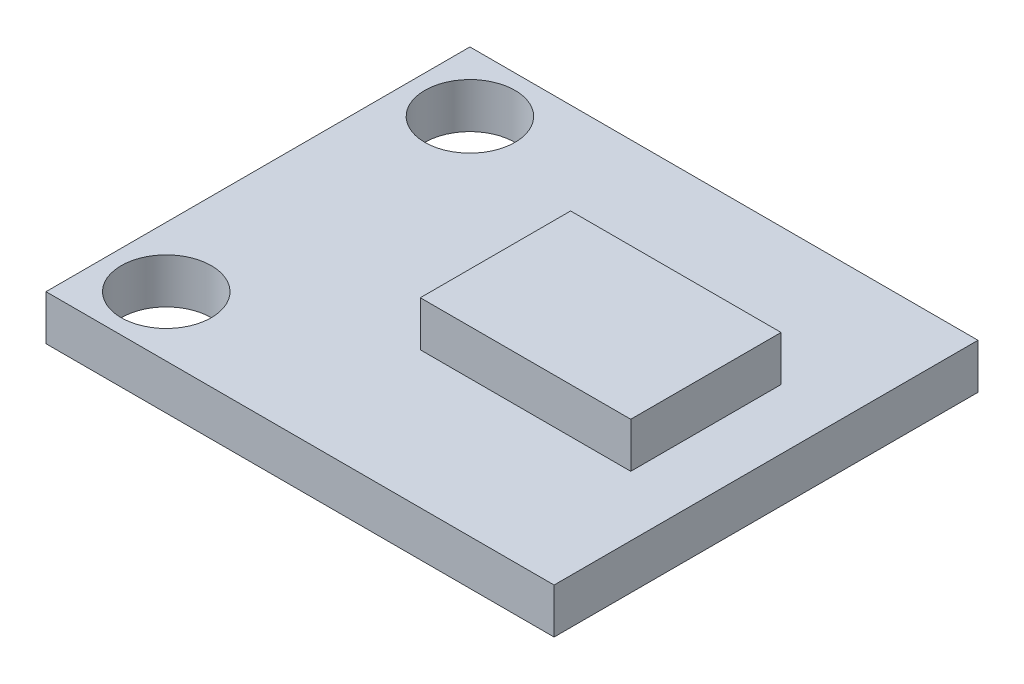
ISO-10303-21;
HEADER;
FILE_DESCRIPTION(('STEP AP214'),'2;1');
FILE_NAME('part.step','',(''),(''),'','','');
FILE_SCHEMA(('AUTOMOTIVE_DESIGN { 1 0 10303 214 1 1 1 1 }'));
ENDSEC;
DATA;
#1=APPLICATION_CONTEXT('core data for automotive mechanical design processes');
#2=APPLICATION_PROTOCOL_DEFINITION('international standard','automotive_design',2000,#1);
#3=PRODUCT_CONTEXT('',#1,'mechanical');
#4=PRODUCT('Part','Part','',(#3));
#5=PRODUCT_RELATED_PRODUCT_CATEGORY('part','',(#4));
#6=PRODUCT_DEFINITION_FORMATION('','',#4);
#7=PRODUCT_DEFINITION_CONTEXT('part definition',#1,'design');
#8=PRODUCT_DEFINITION('design','',#6,#7);
#9=PRODUCT_DEFINITION_SHAPE('','',#8);
#10=(LENGTH_UNIT() NAMED_UNIT(*) SI_UNIT(.MILLI.,.METRE.));
#11=(NAMED_UNIT(*) PLANE_ANGLE_UNIT() SI_UNIT($,.RADIAN.));
#12=(NAMED_UNIT(*) SI_UNIT($,.STERADIAN.) SOLID_ANGLE_UNIT());
#13=UNCERTAINTY_MEASURE_WITH_UNIT(LENGTH_MEASURE(1.E-05),#10,'distance_accuracy_value','');
#14=(GEOMETRIC_REPRESENTATION_CONTEXT(3) GLOBAL_UNCERTAINTY_ASSIGNED_CONTEXT((#13)) GLOBAL_UNIT_ASSIGNED_CONTEXT((#10,
#11,#12)) REPRESENTATION_CONTEXT('',''));
#15=CARTESIAN_POINT('',(0.,0.,0.));
#16=DIRECTION('',(0.,0.,1.));
#17=DIRECTION('',(1.,0.,0.));
#18=AXIS2_PLACEMENT_3D('',#15,#16,#17);
#19=CARTESIAN_POINT('',(0.,1.5,0.));
#20=DIRECTION('',(0.,1.,0.));
#21=DIRECTION('',(0.,0.,1.));
#22=AXIS2_PLACEMENT_3D('',#19,#20,#21);
#23=PLANE('',#22);
#24=CARTESIAN_POINT('',(-6.45,1.5,-5.05));
#25=DIRECTION('',(0.,1.,0.));
#26=DIRECTION('',(0.,0.,1.));
#27=AXIS2_PLACEMENT_3D('',#24,#25,#26);
#28=CIRCLE('',#27,1.5);
#29=CARTESIAN_POINT('',(-6.45,1.5,-3.55));
#30=VERTEX_POINT('',#29);
#31=EDGE_CURVE('E144',#30,#30,#28,.T.);
#32=ORIENTED_EDGE('',*,*,#31,.F.);
#33=EDGE_LOOP('',(#32));
#34=FACE_BOUND('',#33,.T.);
#35=DIRECTION('',(0.,0.,-1.));
#36=VECTOR('',#35,1.);
#37=CARTESIAN_POINT('',(8.45,1.5,-7.05));
#38=LINE('',#37,#36);
#39=CARTESIAN_POINT('',(8.45,1.5,7.05));
#40=VERTEX_POINT('',#39);
#41=CARTESIAN_POINT('',(8.45,1.5,-7.05));
#42=VERTEX_POINT('',#41);
#43=EDGE_CURVE('E150',#40,#42,#38,.T.);
#44=ORIENTED_EDGE('',*,*,#43,.T.);
#45=DIRECTION('',(-1.,0.,0.));
#46=VECTOR('',#45,1.);
#47=CARTESIAN_POINT('',(-8.45,1.5,-7.05));
#48=LINE('',#47,#46);
#49=CARTESIAN_POINT('',(-8.45,1.5,-7.05));
#50=VERTEX_POINT('',#49);
#51=EDGE_CURVE('E86',#42,#50,#48,.T.);
#52=ORIENTED_EDGE('',*,*,#51,.T.);
#53=DIRECTION('',(0.,0.,1.));
#54=VECTOR('',#53,1.);
#55=CARTESIAN_POINT('',(-8.45,1.5,-7.05));
#56=LINE('',#55,#54);
#57=CARTESIAN_POINT('',(-8.45,1.5,7.05));
#58=VERTEX_POINT('',#57);
#59=EDGE_CURVE('E153',#50,#58,#56,.T.);
#60=ORIENTED_EDGE('',*,*,#59,.T.);
#61=DIRECTION('',(1.,0.,0.));
#62=VECTOR('',#61,1.);
#63=CARTESIAN_POINT('',(-8.45,1.5,7.05));
#64=LINE('',#63,#62);
#65=EDGE_CURVE('E58',#58,#40,#64,.T.);
#66=ORIENTED_EDGE('',*,*,#65,.T.);
#67=EDGE_LOOP('',(#44,#52,#60,#66));
#68=FACE_BOUND('',#67,.T.);
#69=CARTESIAN_POINT('',(-6.45,1.5,5.05));
#70=DIRECTION('',(0.,1.,0.));
#71=DIRECTION('',(0.,0.,-1.));
#72=AXIS2_PLACEMENT_3D('',#69,#70,#71);
#73=CIRCLE('',#72,1.5);
#74=CARTESIAN_POINT('',(-6.45,1.5,3.55));
#75=VERTEX_POINT('',#74);
#76=EDGE_CURVE('E136',#75,#75,#73,.T.);
#77=ORIENTED_EDGE('',*,*,#76,.F.);
#78=EDGE_LOOP('',(#77));
#79=FACE_BOUND('',#78,.T.);
#80=DIRECTION('',(-1.,0.,0.));
#81=VECTOR('',#80,1.);
#82=CARTESIAN_POINT('',(-0.550000000000001,1.5,-2.5));
#83=LINE('',#82,#81);
#84=CARTESIAN_POINT('',(6.45,1.5,-2.5));
#85=VERTEX_POINT('',#84);
#86=CARTESIAN_POINT('',(-0.550000000000001,1.5,-2.5));
#87=VERTEX_POINT('',#86);
#88=EDGE_CURVE('E299',#85,#87,#83,.T.);
#89=ORIENTED_EDGE('',*,*,#88,.F.);
#90=DIRECTION('',(0.,0.,-1.));
#91=VECTOR('',#90,1.);
#92=CARTESIAN_POINT('',(6.45,1.5,-2.5));
#93=LINE('',#92,#91);
#94=CARTESIAN_POINT('',(6.45,1.5,2.5));
#95=VERTEX_POINT('',#94);
#96=EDGE_CURVE('E131',#95,#85,#93,.T.);
#97=ORIENTED_EDGE('',*,*,#96,.F.);
#98=DIRECTION('',(1.,0.,0.));
#99=VECTOR('',#98,1.);
#100=CARTESIAN_POINT('',(-0.55,1.5,2.5));
#101=LINE('',#100,#99);
#102=CARTESIAN_POINT('',(-0.55,1.5,2.5));
#103=VERTEX_POINT('',#102);
#104=EDGE_CURVE('E127',#103,#95,#101,.T.);
#105=ORIENTED_EDGE('',*,*,#104,.F.);
#106=DIRECTION('',(0.,0.,1.));
#107=VECTOR('',#106,1.);
#108=CARTESIAN_POINT('',(-0.550000000000001,1.5,-2.5));
#109=LINE('',#108,#107);
#110=EDGE_CURVE('E296',#87,#103,#109,.T.);
#111=ORIENTED_EDGE('',*,*,#110,.F.);
#112=EDGE_LOOP('',(#89,#97,#105,#111));
#113=FACE_BOUND('',#112,.T.);
#114=ADVANCED_FACE('F34',(#34,#68,#79,#113),#23,.T.);
#115=CARTESIAN_POINT('',(0.,0.,0.));
#116=DIRECTION('',(0.,1.,0.));
#117=DIRECTION('',(0.,0.,1.));
#118=AXIS2_PLACEMENT_3D('',#115,#116,#117);
#119=PLANE('',#118);
#120=DIRECTION('',(0.,0.,-1.));
#121=VECTOR('',#120,1.);
#122=CARTESIAN_POINT('',(8.45,0.,-7.05));
#123=LINE('',#122,#121);
#124=CARTESIAN_POINT('',(8.45,0.,7.05));
#125=VERTEX_POINT('',#124);
#126=CARTESIAN_POINT('',(8.45,0.,-7.05));
#127=VERTEX_POINT('',#126);
#128=EDGE_CURVE('E147',#125,#127,#123,.T.);
#129=ORIENTED_EDGE('',*,*,#128,.F.);
#130=DIRECTION('',(1.,0.,0.));
#131=VECTOR('',#130,1.);
#132=CARTESIAN_POINT('',(-8.45,0.,7.05));
#133=LINE('',#132,#131);
#134=CARTESIAN_POINT('',(-8.45,0.,7.05));
#135=VERTEX_POINT('',#134);
#136=EDGE_CURVE('E79',#135,#125,#133,.T.);
#137=ORIENTED_EDGE('',*,*,#136,.F.);
#138=DIRECTION('',(0.,0.,1.));
#139=VECTOR('',#138,1.);
#140=CARTESIAN_POINT('',(-8.45,0.,-7.05));
#141=LINE('',#140,#139);
#142=CARTESIAN_POINT('',(-8.45,0.,-7.05));
#143=VERTEX_POINT('',#142);
#144=EDGE_CURVE('E161',#143,#135,#141,.T.);
#145=ORIENTED_EDGE('',*,*,#144,.F.);
#146=DIRECTION('',(-1.,0.,0.));
#147=VECTOR('',#146,1.);
#148=CARTESIAN_POINT('',(-8.45,0.,-7.05));
#149=LINE('',#148,#147);
#150=EDGE_CURVE('E159',#127,#143,#149,.T.);
#151=ORIENTED_EDGE('',*,*,#150,.F.);
#152=EDGE_LOOP('',(#129,#137,#145,#151));
#153=FACE_BOUND('',#152,.T.);
#154=CARTESIAN_POINT('',(-6.45,0.,-5.05));
#155=DIRECTION('',(0.,1.,0.));
#156=DIRECTION('',(0.,0.,1.));
#157=AXIS2_PLACEMENT_3D('',#154,#155,#156);
#158=CIRCLE('',#157,1.5);
#159=CARTESIAN_POINT('',(-6.45,0.,-3.55));
#160=VERTEX_POINT('',#159);
#161=EDGE_CURVE('E142',#160,#160,#158,.T.);
#162=ORIENTED_EDGE('',*,*,#161,.T.);
#163=EDGE_LOOP('',(#162));
#164=FACE_BOUND('',#163,.T.);
#165=CARTESIAN_POINT('',(-6.45,0.,5.05));
#166=DIRECTION('',(0.,1.,0.));
#167=DIRECTION('',(0.,0.,-1.));
#168=AXIS2_PLACEMENT_3D('',#165,#166,#167);
#169=CIRCLE('',#168,1.5);
#170=CARTESIAN_POINT('',(-6.45,0.,3.55));
#171=VERTEX_POINT('',#170);
#172=EDGE_CURVE('E133',#171,#171,#169,.T.);
#173=ORIENTED_EDGE('',*,*,#172,.T.);
#174=EDGE_LOOP('',(#173));
#175=FACE_BOUND('',#174,.T.);
#176=ADVANCED_FACE('F174',(#153,#164,#175),#119,.F.);
#177=CARTESIAN_POINT('',(8.45,1.5,-7.05));
#178=DIRECTION('',(-1.,0.,0.));
#179=DIRECTION('',(0.,0.,1.));
#180=AXIS2_PLACEMENT_3D('',#177,#178,#179);
#181=PLANE('',#180);
#182=ORIENTED_EDGE('',*,*,#128,.T.);
#183=DIRECTION('',(0.,-1.,0.));
#184=VECTOR('',#183,1.);
#185=CARTESIAN_POINT('',(8.45,1.5,-7.05));
#186=LINE('',#185,#184);
#187=EDGE_CURVE('E11',#42,#127,#186,.T.);
#188=ORIENTED_EDGE('',*,*,#187,.F.);
#189=ORIENTED_EDGE('',*,*,#43,.F.);
#190=DIRECTION('',(0.,-1.,0.));
#191=VECTOR('',#190,1.);
#192=CARTESIAN_POINT('',(8.45,1.5,7.05));
#193=LINE('',#192,#191);
#194=EDGE_CURVE('E156',#40,#125,#193,.T.);
#195=ORIENTED_EDGE('',*,*,#194,.T.);
#196=EDGE_LOOP('',(#182,#188,#189,#195));
#197=FACE_BOUND('',#196,.T.);
#198=ADVANCED_FACE('F36',(#197),#181,.F.);
#199=CARTESIAN_POINT('',(-8.45,1.5,-7.05));
#200=DIRECTION('',(0.,0.,1.));
#201=DIRECTION('',(1.,0.,0.));
#202=AXIS2_PLACEMENT_3D('',#199,#200,#201);
#203=PLANE('',#202);
#204=ORIENTED_EDGE('',*,*,#150,.T.);
#205=DIRECTION('',(0.,-1.,0.));
#206=VECTOR('',#205,1.);
#207=CARTESIAN_POINT('',(-8.45,1.5,-7.05));
#208=LINE('',#207,#206);
#209=EDGE_CURVE('E42',#50,#143,#208,.T.);
#210=ORIENTED_EDGE('',*,*,#209,.F.);
#211=ORIENTED_EDGE('',*,*,#51,.F.);
#212=ORIENTED_EDGE('',*,*,#187,.T.);
#213=EDGE_LOOP('',(#204,#210,#211,#212));
#214=FACE_BOUND('',#213,.T.);
#215=ADVANCED_FACE('F190',(#214),#203,.F.);
#216=CARTESIAN_POINT('',(-8.45,1.5,-7.05));
#217=DIRECTION('',(1.,0.,0.));
#218=DIRECTION('',(0.,0.,-1.));
#219=AXIS2_PLACEMENT_3D('',#216,#217,#218);
#220=PLANE('',#219);
#221=ORIENTED_EDGE('',*,*,#144,.T.);
#222=DIRECTION('',(0.,-1.,0.));
#223=VECTOR('',#222,1.);
#224=CARTESIAN_POINT('',(-8.45,1.5,7.05));
#225=LINE('',#224,#223);
#226=EDGE_CURVE('E165',#58,#135,#225,.T.);
#227=ORIENTED_EDGE('',*,*,#226,.F.);
#228=ORIENTED_EDGE('',*,*,#59,.F.);
#229=ORIENTED_EDGE('',*,*,#209,.T.);
#230=EDGE_LOOP('',(#221,#227,#228,#229));
#231=FACE_BOUND('',#230,.T.);
#232=ADVANCED_FACE('F170',(#231),#220,.F.);
#233=CARTESIAN_POINT('',(-8.45,1.5,7.05));
#234=DIRECTION('',(0.,0.,-1.));
#235=DIRECTION('',(-1.,0.,0.));
#236=AXIS2_PLACEMENT_3D('',#233,#234,#235);
#237=PLANE('',#236);
#238=ORIENTED_EDGE('',*,*,#136,.T.);
#239=ORIENTED_EDGE('',*,*,#194,.F.);
#240=ORIENTED_EDGE('',*,*,#65,.F.);
#241=ORIENTED_EDGE('',*,*,#226,.T.);
#242=EDGE_LOOP('',(#238,#239,#240,#241));
#243=FACE_BOUND('',#242,.T.);
#244=ADVANCED_FACE('F179',(#243),#237,.F.);
#245=CARTESIAN_POINT('',(-6.45,1.5,-5.05));
#246=DIRECTION('',(0.,-1.,0.));
#247=DIRECTION('',(0.,0.,-1.));
#248=AXIS2_PLACEMENT_3D('',#245,#246,#247);
#249=CYLINDRICAL_SURFACE('',#248,1.5);
#250=ORIENTED_EDGE('',*,*,#31,.T.);
#251=EDGE_LOOP('',(#250));
#252=FACE_BOUND('',#251,.T.);
#253=ORIENTED_EDGE('',*,*,#161,.F.);
#254=EDGE_LOOP('',(#253));
#255=FACE_BOUND('',#254,.T.);
#256=ADVANCED_FACE('F181',(#252,#255),#249,.F.);
#257=CARTESIAN_POINT('',(-6.45,1.5,5.05));
#258=DIRECTION('',(0.,-1.,0.));
#259=DIRECTION('',(0.,0.,-1.));
#260=AXIS2_PLACEMENT_3D('',#257,#258,#259);
#261=CYLINDRICAL_SURFACE('',#260,1.5);
#262=ORIENTED_EDGE('',*,*,#76,.T.);
#263=EDGE_LOOP('',(#262));
#264=FACE_BOUND('',#263,.T.);
#265=ORIENTED_EDGE('',*,*,#172,.F.);
#266=EDGE_LOOP('',(#265));
#267=FACE_BOUND('',#266,.T.);
#268=ADVANCED_FACE('F187',(#264,#267),#261,.F.);
#269=CARTESIAN_POINT('',(6.45,3.,-2.5));
#270=DIRECTION('',(-1.,0.,0.));
#271=DIRECTION('',(0.,0.,1.));
#272=AXIS2_PLACEMENT_3D('',#269,#270,#271);
#273=PLANE('',#272);
#274=ORIENTED_EDGE('',*,*,#96,.T.);
#275=DIRECTION('',(0.,-1.,0.));
#276=VECTOR('',#275,1.);
#277=CARTESIAN_POINT('',(6.45,3.,-2.5));
#278=LINE('',#277,#276);
#279=CARTESIAN_POINT('',(6.45,3.,-2.5));
#280=VERTEX_POINT('',#279);
#281=EDGE_CURVE('E112',#280,#85,#278,.T.);
#282=ORIENTED_EDGE('',*,*,#281,.F.);
#283=DIRECTION('',(0.,0.,-1.));
#284=VECTOR('',#283,1.);
#285=CARTESIAN_POINT('',(6.45,3.,-2.5));
#286=LINE('',#285,#284);
#287=CARTESIAN_POINT('',(6.45,3.,2.5));
#288=VERTEX_POINT('',#287);
#289=EDGE_CURVE('E119',#288,#280,#286,.T.);
#290=ORIENTED_EDGE('',*,*,#289,.F.);
#291=DIRECTION('',(0.,-1.,0.));
#292=VECTOR('',#291,1.);
#293=CARTESIAN_POINT('',(6.45,3.,2.5));
#294=LINE('',#293,#292);
#295=EDGE_CURVE('E293',#288,#95,#294,.T.);
#296=ORIENTED_EDGE('',*,*,#295,.T.);
#297=EDGE_LOOP('',(#274,#282,#290,#296));
#298=FACE_BOUND('',#297,.T.);
#299=ADVANCED_FACE('F129',(#298),#273,.F.);
#300=CARTESIAN_POINT('',(-0.550000000000001,3.,-2.5));
#301=DIRECTION('',(0.,0.,1.));
#302=DIRECTION('',(1.,0.,0.));
#303=AXIS2_PLACEMENT_3D('',#300,#301,#302);
#304=PLANE('',#303);
#305=ORIENTED_EDGE('',*,*,#88,.T.);
#306=DIRECTION('',(0.,-1.,0.));
#307=VECTOR('',#306,1.);
#308=CARTESIAN_POINT('',(-0.550000000000001,3.,-2.5));
#309=LINE('',#308,#307);
#310=CARTESIAN_POINT('',(-0.550000000000001,3.,-2.5));
#311=VERTEX_POINT('',#310);
#312=EDGE_CURVE('E115',#311,#87,#309,.T.);
#313=ORIENTED_EDGE('',*,*,#312,.F.);
#314=DIRECTION('',(-1.,0.,0.));
#315=VECTOR('',#314,1.);
#316=CARTESIAN_POINT('',(-0.550000000000001,3.,-2.5));
#317=LINE('',#316,#315);
#318=EDGE_CURVE('E108',#280,#311,#317,.T.);
#319=ORIENTED_EDGE('',*,*,#318,.F.);
#320=ORIENTED_EDGE('',*,*,#281,.T.);
#321=EDGE_LOOP('',(#305,#313,#319,#320));
#322=FACE_BOUND('',#321,.T.);
#323=ADVANCED_FACE('F110',(#322),#304,.F.);
#324=CARTESIAN_POINT('',(-0.550000000000001,3.,-2.5));
#325=DIRECTION('',(1.,0.,0.));
#326=DIRECTION('',(0.,0.,-1.));
#327=AXIS2_PLACEMENT_3D('',#324,#325,#326);
#328=PLANE('',#327);
#329=ORIENTED_EDGE('',*,*,#110,.T.);
#330=DIRECTION('',(0.,-1.,0.));
#331=VECTOR('',#330,1.);
#332=CARTESIAN_POINT('',(-0.55,3.,2.5));
#333=LINE('',#332,#331);
#334=CARTESIAN_POINT('',(-0.55,3.,2.5));
#335=VERTEX_POINT('',#334);
#336=EDGE_CURVE('E49',#335,#103,#333,.T.);
#337=ORIENTED_EDGE('',*,*,#336,.F.);
#338=DIRECTION('',(0.,0.,1.));
#339=VECTOR('',#338,1.);
#340=CARTESIAN_POINT('',(-0.550000000000001,3.,-2.5));
#341=LINE('',#340,#339);
#342=EDGE_CURVE('E118',#311,#335,#341,.T.);
#343=ORIENTED_EDGE('',*,*,#342,.F.);
#344=ORIENTED_EDGE('',*,*,#312,.T.);
#345=EDGE_LOOP('',(#329,#337,#343,#344));
#346=FACE_BOUND('',#345,.T.);
#347=ADVANCED_FACE('F208',(#346),#328,.F.);
#348=CARTESIAN_POINT('',(-0.55,3.,2.5));
#349=DIRECTION('',(0.,0.,-1.));
#350=DIRECTION('',(-1.,0.,0.));
#351=AXIS2_PLACEMENT_3D('',#348,#349,#350);
#352=PLANE('',#351);
#353=ORIENTED_EDGE('',*,*,#104,.T.);
#354=ORIENTED_EDGE('',*,*,#295,.F.);
#355=DIRECTION('',(1.,0.,0.));
#356=VECTOR('',#355,1.);
#357=CARTESIAN_POINT('',(-0.55,3.,2.5));
#358=LINE('',#357,#356);
#359=EDGE_CURVE('E123',#335,#288,#358,.T.);
#360=ORIENTED_EDGE('',*,*,#359,.F.);
#361=ORIENTED_EDGE('',*,*,#336,.T.);
#362=EDGE_LOOP('',(#353,#354,#360,#361));
#363=FACE_BOUND('',#362,.T.);
#364=ADVANCED_FACE('F211',(#363),#352,.F.);
#365=CARTESIAN_POINT('',(0.,3.,0.));
#366=DIRECTION('',(0.,1.,0.));
#367=DIRECTION('',(0.,0.,1.));
#368=AXIS2_PLACEMENT_3D('',#365,#366,#367);
#369=PLANE('',#368);
#370=ORIENTED_EDGE('',*,*,#289,.T.);
#371=ORIENTED_EDGE('',*,*,#318,.T.);
#372=ORIENTED_EDGE('',*,*,#342,.T.);
#373=ORIENTED_EDGE('',*,*,#359,.T.);
#374=EDGE_LOOP('',(#370,#371,#372,#373));
#375=FACE_BOUND('',#374,.T.);
#376=ADVANCED_FACE('F122',(#375),#369,.T.);
#377=CLOSED_SHELL('',(#114,#176,#198,#215,#232,#244,#256,#268,#299,#323,#347,#364,#376));
#378=MANIFOLD_SOLID_BREP('B2',#377);
#379=ADVANCED_BREP_SHAPE_REPRESENTATION('',(#18,#378),#14);
#380=SHAPE_DEFINITION_REPRESENTATION(#9,#379);
ENDSEC;
END-ISO-10303-21;
